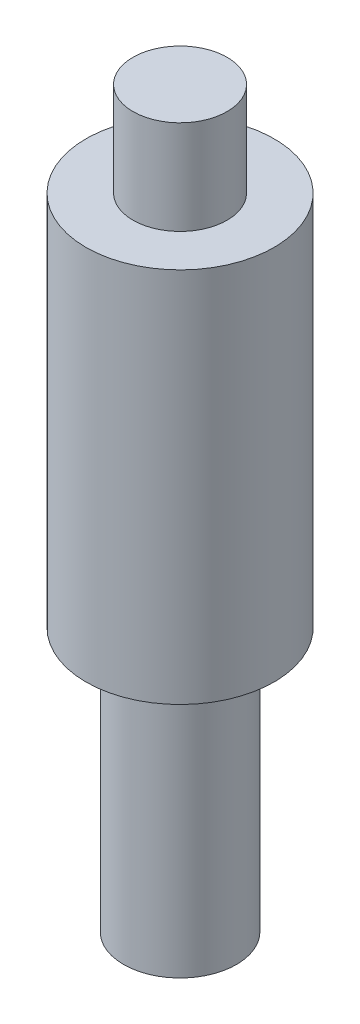
ISO-10303-21;
HEADER;
FILE_DESCRIPTION(('STEP AP214'),'2;1');
FILE_NAME('part.step','',(''),(''),'','','');
FILE_SCHEMA(('AUTOMOTIVE_DESIGN { 1 0 10303 214 1 1 1 1 }'));
ENDSEC;
DATA;
#1=APPLICATION_CONTEXT('core data for automotive mechanical design processes');
#2=APPLICATION_PROTOCOL_DEFINITION('international standard','automotive_design',2000,#1);
#3=PRODUCT_CONTEXT('',#1,'mechanical');
#4=PRODUCT('Part','Part','',(#3));
#5=PRODUCT_RELATED_PRODUCT_CATEGORY('part','',(#4));
#6=PRODUCT_DEFINITION_FORMATION('','',#4);
#7=PRODUCT_DEFINITION_CONTEXT('part definition',#1,'design');
#8=PRODUCT_DEFINITION('design','',#6,#7);
#9=PRODUCT_DEFINITION_SHAPE('','',#8);
#10=(LENGTH_UNIT() NAMED_UNIT(*) SI_UNIT(.MILLI.,.METRE.));
#11=(NAMED_UNIT(*) PLANE_ANGLE_UNIT() SI_UNIT($,.RADIAN.));
#12=(NAMED_UNIT(*) SI_UNIT($,.STERADIAN.) SOLID_ANGLE_UNIT());
#13=UNCERTAINTY_MEASURE_WITH_UNIT(LENGTH_MEASURE(1.E-05),#10,'distance_accuracy_value','');
#14=(GEOMETRIC_REPRESENTATION_CONTEXT(3) GLOBAL_UNCERTAINTY_ASSIGNED_CONTEXT((#13)) GLOBAL_UNIT_ASSIGNED_CONTEXT((#10,
#11,#12)) REPRESENTATION_CONTEXT('',''));
#15=CARTESIAN_POINT('',(0.,0.,0.));
#16=DIRECTION('',(0.,0.,1.));
#17=DIRECTION('',(1.,0.,0.));
#18=AXIS2_PLACEMENT_3D('',#15,#16,#17);
#19=CARTESIAN_POINT('',(0.,7.,0.));
#20=DIRECTION('',(0.,-1.,0.));
#21=DIRECTION('',(0.,0.,-1.));
#22=AXIS2_PLACEMENT_3D('',#19,#20,#21);
#23=CYLINDRICAL_SURFACE('',#22,1.5);
#24=CARTESIAN_POINT('',(0.,7.,0.));
#25=DIRECTION('',(0.,1.,0.));
#26=DIRECTION('',(0.,0.,1.));
#27=AXIS2_PLACEMENT_3D('',#24,#25,#26);
#28=CIRCLE('',#27,1.5);
#29=CARTESIAN_POINT('',(0.,7.,1.5));
#30=VERTEX_POINT('',#29);
#31=EDGE_CURVE('E48',#30,#30,#28,.T.);
#32=ORIENTED_EDGE('',*,*,#31,.F.);
#33=EDGE_LOOP('',(#32));
#34=FACE_BOUND('',#33,.T.);
#35=CARTESIAN_POINT('',(0.,0.,0.));
#36=DIRECTION('',(0.,1.,0.));
#37=DIRECTION('',(0.,0.,1.));
#38=AXIS2_PLACEMENT_3D('',#35,#36,#37);
#39=CIRCLE('',#38,1.5);
#40=CARTESIAN_POINT('',(0.,0.,1.5));
#41=VERTEX_POINT('',#40);
#42=EDGE_CURVE('E44',#41,#41,#39,.T.);
#43=ORIENTED_EDGE('',*,*,#42,.T.);
#44=EDGE_LOOP('',(#43));
#45=FACE_BOUND('',#44,.T.);
#46=ADVANCED_FACE('F41',(#34,#45),#23,.T.);
#47=CARTESIAN_POINT('',(0.,0.,0.));
#48=DIRECTION('',(0.,1.,0.));
#49=DIRECTION('',(0.,0.,1.));
#50=AXIS2_PLACEMENT_3D('',#47,#48,#49);
#51=PLANE('',#50);
#52=ORIENTED_EDGE('',*,*,#42,.F.);
#53=EDGE_LOOP('',(#52));
#54=FACE_BOUND('',#53,.T.);
#55=ADVANCED_FACE('F83',(#54),#51,.F.);
#56=CARTESIAN_POINT('',(0.,17.,0.));
#57=DIRECTION('',(0.,-1.,0.));
#58=DIRECTION('',(0.,0.,-1.));
#59=AXIS2_PLACEMENT_3D('',#56,#57,#58);
#60=CYLINDRICAL_SURFACE('',#59,2.5);
#61=CARTESIAN_POINT('',(0.,17.,0.));
#62=DIRECTION('',(0.,1.,0.));
#63=DIRECTION('',(0.,0.,1.));
#64=AXIS2_PLACEMENT_3D('',#61,#62,#63);
#65=CIRCLE('',#64,2.5);
#66=CARTESIAN_POINT('',(0.,17.,2.5));
#67=VERTEX_POINT('',#66);
#68=EDGE_CURVE('E56',#67,#67,#65,.T.);
#69=ORIENTED_EDGE('',*,*,#68,.F.);
#70=EDGE_LOOP('',(#69));
#71=FACE_BOUND('',#70,.T.);
#72=CARTESIAN_POINT('',(0.,7.,0.));
#73=DIRECTION('',(0.,1.,0.));
#74=DIRECTION('',(0.,0.,1.));
#75=AXIS2_PLACEMENT_3D('',#72,#73,#74);
#76=CIRCLE('',#75,2.5);
#77=CARTESIAN_POINT('',(0.,7.,2.5));
#78=VERTEX_POINT('',#77);
#79=EDGE_CURVE('E59',#78,#78,#76,.T.);
#80=ORIENTED_EDGE('',*,*,#79,.T.);
#81=EDGE_LOOP('',(#80));
#82=FACE_BOUND('',#81,.T.);
#83=ADVANCED_FACE('F88',(#71,#82),#60,.T.);
#84=CARTESIAN_POINT('',(0.,17.,0.));
#85=DIRECTION('',(0.,1.,0.));
#86=DIRECTION('',(0.,0.,1.));
#87=AXIS2_PLACEMENT_3D('',#84,#85,#86);
#88=PLANE('',#87);
#89=CARTESIAN_POINT('',(0.,17.,0.));
#90=DIRECTION('',(0.,1.,0.));
#91=DIRECTION('',(0.,0.,1.));
#92=AXIS2_PLACEMENT_3D('',#89,#90,#91);
#93=CIRCLE('',#92,1.25);
#94=CARTESIAN_POINT('',(0.,17.,1.25));
#95=VERTEX_POINT('',#94);
#96=EDGE_CURVE('E10',#95,#95,#93,.T.);
#97=ORIENTED_EDGE('',*,*,#96,.F.);
#98=EDGE_LOOP('',(#97));
#99=FACE_BOUND('',#98,.T.);
#100=ORIENTED_EDGE('',*,*,#68,.T.);
#101=EDGE_LOOP('',(#100));
#102=FACE_BOUND('',#101,.T.);
#103=ADVANCED_FACE('F78',(#99,#102),#88,.T.);
#104=CARTESIAN_POINT('',(0.,7.,0.));
#105=DIRECTION('',(0.,1.,0.));
#106=DIRECTION('',(0.,0.,1.));
#107=AXIS2_PLACEMENT_3D('',#104,#105,#106);
#108=PLANE('',#107);
#109=ORIENTED_EDGE('',*,*,#31,.T.);
#110=EDGE_LOOP('',(#109));
#111=FACE_BOUND('',#110,.T.);
#112=ORIENTED_EDGE('',*,*,#79,.F.);
#113=EDGE_LOOP('',(#112));
#114=FACE_BOUND('',#113,.T.);
#115=ADVANCED_FACE('F70',(#111,#114),#108,.F.);
#116=CARTESIAN_POINT('',(0.,19.5,0.));
#117=DIRECTION('',(0.,-1.,0.));
#118=DIRECTION('',(0.,0.,-1.));
#119=AXIS2_PLACEMENT_3D('',#116,#117,#118);
#120=CYLINDRICAL_SURFACE('',#119,1.25);
#121=CARTESIAN_POINT('',(0.,19.5,0.));
#122=DIRECTION('',(0.,1.,0.));
#123=DIRECTION('',(0.,0.,1.));
#124=AXIS2_PLACEMENT_3D('',#121,#122,#123);
#125=CIRCLE('',#124,1.25);
#126=CARTESIAN_POINT('',(0.,19.5,1.25));
#127=VERTEX_POINT('',#126);
#128=EDGE_CURVE('E55',#127,#127,#125,.T.);
#129=ORIENTED_EDGE('',*,*,#128,.F.);
#130=EDGE_LOOP('',(#129));
#131=FACE_BOUND('',#130,.T.);
#132=ORIENTED_EDGE('',*,*,#96,.T.);
#133=EDGE_LOOP('',(#132));
#134=FACE_BOUND('',#133,.T.);
#135=ADVANCED_FACE('F68',(#131,#134),#120,.T.);
#136=CARTESIAN_POINT('',(0.,19.5,0.));
#137=DIRECTION('',(0.,1.,0.));
#138=DIRECTION('',(0.,0.,1.));
#139=AXIS2_PLACEMENT_3D('',#136,#137,#138);
#140=PLANE('',#139);
#141=ORIENTED_EDGE('',*,*,#128,.T.);
#142=EDGE_LOOP('',(#141));
#143=FACE_BOUND('',#142,.T.);
#144=ADVANCED_FACE('F66',(#143),#140,.T.);
#145=CLOSED_SHELL('',(#46,#55,#83,#103,#115,#135,#144));
#146=MANIFOLD_SOLID_BREP('B2',#145);
#147=ADVANCED_BREP_SHAPE_REPRESENTATION('',(#18,#146),#14);
#148=SHAPE_DEFINITION_REPRESENTATION(#9,#147);
ENDSEC;
END-ISO-10303-21;
